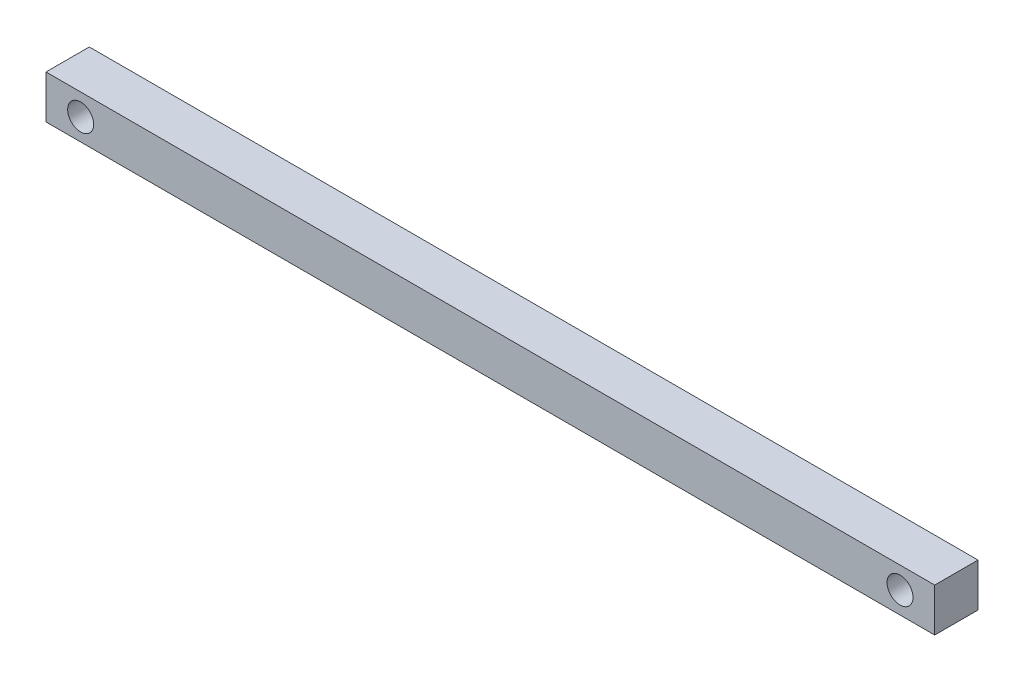
ISO-10303-21;
HEADER;
FILE_DESCRIPTION(('STEP AP214'),'2;1');
FILE_NAME('part.step','',(''),(''),'','','');
FILE_SCHEMA(('AUTOMOTIVE_DESIGN { 1 0 10303 214 1 1 1 1 }'));
ENDSEC;
DATA;
#1=APPLICATION_CONTEXT('core data for automotive mechanical design processes');
#2=APPLICATION_PROTOCOL_DEFINITION('international standard','automotive_design',2000,#1);
#3=PRODUCT_CONTEXT('',#1,'mechanical');
#4=PRODUCT('Part','Part','',(#3));
#5=PRODUCT_RELATED_PRODUCT_CATEGORY('part','',(#4));
#6=PRODUCT_DEFINITION_FORMATION('','',#4);
#7=PRODUCT_DEFINITION_CONTEXT('part definition',#1,'design');
#8=PRODUCT_DEFINITION('design','',#6,#7);
#9=PRODUCT_DEFINITION_SHAPE('','',#8);
#10=(LENGTH_UNIT() NAMED_UNIT(*) SI_UNIT(.MILLI.,.METRE.));
#11=(NAMED_UNIT(*) PLANE_ANGLE_UNIT() SI_UNIT($,.RADIAN.));
#12=(NAMED_UNIT(*) SI_UNIT($,.STERADIAN.) SOLID_ANGLE_UNIT());
#13=UNCERTAINTY_MEASURE_WITH_UNIT(LENGTH_MEASURE(1.E-05),#10,'distance_accuracy_value','');
#14=(GEOMETRIC_REPRESENTATION_CONTEXT(3) GLOBAL_UNCERTAINTY_ASSIGNED_CONTEXT((#13)) GLOBAL_UNIT_ASSIGNED_CONTEXT((#10,
#11,#12)) REPRESENTATION_CONTEXT('',''));
#15=CARTESIAN_POINT('',(0.,0.,0.));
#16=DIRECTION('',(0.,0.,1.));
#17=DIRECTION('',(1.,0.,0.));
#18=AXIS2_PLACEMENT_3D('',#15,#16,#17);
#19=CARTESIAN_POINT('',(0.,0.,25.));
#20=DIRECTION('',(0.,0.,1.));
#21=DIRECTION('',(1.,0.,0.));
#22=AXIS2_PLACEMENT_3D('',#19,#20,#21);
#23=PLANE('',#22);
#24=CARTESIAN_POINT('',(-236.5,0.,25.));
#25=DIRECTION('',(0.,0.,1.));
#26=DIRECTION('',(1.,0.,0.));
#27=AXIS2_PLACEMENT_3D('',#24,#25,#26);
#28=CIRCLE('',#27,7.50000000000001);
#29=CARTESIAN_POINT('',(-229.,0.,25.));
#30=VERTEX_POINT('',#29);
#31=EDGE_CURVE('E112',#30,#30,#28,.T.);
#32=ORIENTED_EDGE('',*,*,#31,.F.);
#33=EDGE_LOOP('',(#32));
#34=FACE_BOUND('',#33,.T.);
#35=DIRECTION('',(0.,1.,0.));
#36=VECTOR('',#35,1.);
#37=CARTESIAN_POINT('',(256.5,12.5,25.));
#38=LINE('',#37,#36);
#39=CARTESIAN_POINT('',(256.5,-12.5,25.));
#40=VERTEX_POINT('',#39);
#41=CARTESIAN_POINT('',(256.5,12.5,25.));
#42=VERTEX_POINT('',#41);
#43=EDGE_CURVE('E92',#40,#42,#38,.T.);
#44=ORIENTED_EDGE('',*,*,#43,.T.);
#45=DIRECTION('',(-1.,0.,0.));
#46=VECTOR('',#45,1.);
#47=CARTESIAN_POINT('',(-256.5,12.5,25.));
#48=LINE('',#47,#46);
#49=CARTESIAN_POINT('',(-256.5,12.5,25.));
#50=VERTEX_POINT('',#49);
#51=EDGE_CURVE('E87',#42,#50,#48,.T.);
#52=ORIENTED_EDGE('',*,*,#51,.T.);
#53=DIRECTION('',(0.,-1.,0.));
#54=VECTOR('',#53,1.);
#55=CARTESIAN_POINT('',(-256.5,12.5,25.));
#56=LINE('',#55,#54);
#57=CARTESIAN_POINT('',(-256.5,-12.5,25.));
#58=VERTEX_POINT('',#57);
#59=EDGE_CURVE('E90',#50,#58,#56,.T.);
#60=ORIENTED_EDGE('',*,*,#59,.T.);
#61=DIRECTION('',(1.,0.,0.));
#62=VECTOR('',#61,1.);
#63=CARTESIAN_POINT('',(-256.5,-12.5,25.));
#64=LINE('',#63,#62);
#65=EDGE_CURVE('E57',#58,#40,#64,.T.);
#66=ORIENTED_EDGE('',*,*,#65,.T.);
#67=EDGE_LOOP('',(#44,#52,#60,#66));
#68=FACE_BOUND('',#67,.T.);
#69=CARTESIAN_POINT('',(236.5,0.,25.));
#70=DIRECTION('',(0.,0.,1.));
#71=DIRECTION('',(1.,0.,0.));
#72=AXIS2_PLACEMENT_3D('',#69,#70,#71);
#73=CIRCLE('',#72,7.50000000000001);
#74=CARTESIAN_POINT('',(244.,0.,25.));
#75=VERTEX_POINT('',#74);
#76=EDGE_CURVE('E134',#75,#75,#73,.T.);
#77=ORIENTED_EDGE('',*,*,#76,.F.);
#78=EDGE_LOOP('',(#77));
#79=FACE_BOUND('',#78,.T.);
#80=ADVANCED_FACE('F39',(#34,#68,#79),#23,.T.);
#81=CARTESIAN_POINT('',(0.,0.,0.));
#82=DIRECTION('',(0.,0.,1.));
#83=DIRECTION('',(1.,0.,0.));
#84=AXIS2_PLACEMENT_3D('',#81,#82,#83);
#85=PLANE('',#84);
#86=DIRECTION('',(0.,1.,0.));
#87=VECTOR('',#86,1.);
#88=CARTESIAN_POINT('',(256.5,12.5,0.));
#89=LINE('',#88,#87);
#90=CARTESIAN_POINT('',(256.5,-12.5,0.));
#91=VERTEX_POINT('',#90);
#92=CARTESIAN_POINT('',(256.5,12.5,0.));
#93=VERTEX_POINT('',#92);
#94=EDGE_CURVE('E108',#91,#93,#89,.T.);
#95=ORIENTED_EDGE('',*,*,#94,.F.);
#96=DIRECTION('',(1.,0.,0.));
#97=VECTOR('',#96,1.);
#98=CARTESIAN_POINT('',(-256.5,-12.5,0.));
#99=LINE('',#98,#97);
#100=CARTESIAN_POINT('',(-256.5,-12.5,0.));
#101=VERTEX_POINT('',#100);
#102=EDGE_CURVE('E80',#101,#91,#99,.T.);
#103=ORIENTED_EDGE('',*,*,#102,.F.);
#104=DIRECTION('',(0.,-1.,0.));
#105=VECTOR('',#104,1.);
#106=CARTESIAN_POINT('',(-256.5,12.5,0.));
#107=LINE('',#106,#105);
#108=CARTESIAN_POINT('',(-256.5,12.5,0.));
#109=VERTEX_POINT('',#108);
#110=EDGE_CURVE('E74',#109,#101,#107,.T.);
#111=ORIENTED_EDGE('',*,*,#110,.F.);
#112=DIRECTION('',(-1.,0.,0.));
#113=VECTOR('',#112,1.);
#114=CARTESIAN_POINT('',(-256.5,12.5,0.));
#115=LINE('',#114,#113);
#116=EDGE_CURVE('E97',#93,#109,#115,.T.);
#117=ORIENTED_EDGE('',*,*,#116,.F.);
#118=EDGE_LOOP('',(#95,#103,#111,#117));
#119=FACE_BOUND('',#118,.T.);
#120=CARTESIAN_POINT('',(-236.5,0.,0.));
#121=DIRECTION('',(0.,0.,1.));
#122=DIRECTION('',(1.,0.,0.));
#123=AXIS2_PLACEMENT_3D('',#120,#121,#122);
#124=CIRCLE('',#123,7.50000000000001);
#125=CARTESIAN_POINT('',(-229.,0.,0.));
#126=VERTEX_POINT('',#125);
#127=EDGE_CURVE('E130',#126,#126,#124,.T.);
#128=ORIENTED_EDGE('',*,*,#127,.T.);
#129=EDGE_LOOP('',(#128));
#130=FACE_BOUND('',#129,.T.);
#131=CARTESIAN_POINT('',(236.5,0.,0.));
#132=DIRECTION('',(0.,0.,1.));
#133=DIRECTION('',(1.,0.,0.));
#134=AXIS2_PLACEMENT_3D('',#131,#132,#133);
#135=CIRCLE('',#134,7.50000000000001);
#136=CARTESIAN_POINT('',(244.,0.,0.));
#137=VERTEX_POINT('',#136);
#138=EDGE_CURVE('E138',#137,#137,#135,.T.);
#139=ORIENTED_EDGE('',*,*,#138,.T.);
#140=EDGE_LOOP('',(#139));
#141=FACE_BOUND('',#140,.T.);
#142=ADVANCED_FACE('F125',(#119,#130,#141),#85,.F.);
#143=CARTESIAN_POINT('',(256.5,12.5,25.));
#144=DIRECTION('',(-1.,0.,0.));
#145=DIRECTION('',(0.,0.,1.));
#146=AXIS2_PLACEMENT_3D('',#143,#144,#145);
#147=PLANE('',#146);
#148=ORIENTED_EDGE('',*,*,#94,.T.);
#149=DIRECTION('',(0.,0.,-1.));
#150=VECTOR('',#149,1.);
#151=CARTESIAN_POINT('',(256.5,12.5,25.));
#152=LINE('',#151,#150);
#153=EDGE_CURVE('E11',#42,#93,#152,.T.);
#154=ORIENTED_EDGE('',*,*,#153,.F.);
#155=ORIENTED_EDGE('',*,*,#43,.F.);
#156=DIRECTION('',(0.,0.,-1.));
#157=VECTOR('',#156,1.);
#158=CARTESIAN_POINT('',(256.5,-12.5,25.));
#159=LINE('',#158,#157);
#160=EDGE_CURVE('E104',#40,#91,#159,.T.);
#161=ORIENTED_EDGE('',*,*,#160,.T.);
#162=EDGE_LOOP('',(#148,#154,#155,#161));
#163=FACE_BOUND('',#162,.T.);
#164=ADVANCED_FACE('F41',(#163),#147,.F.);
#165=CARTESIAN_POINT('',(-256.5,12.5,25.));
#166=DIRECTION('',(0.,-1.,0.));
#167=DIRECTION('',(0.,0.,-1.));
#168=AXIS2_PLACEMENT_3D('',#165,#166,#167);
#169=PLANE('',#168);
#170=ORIENTED_EDGE('',*,*,#116,.T.);
#171=DIRECTION('',(0.,0.,-1.));
#172=VECTOR('',#171,1.);
#173=CARTESIAN_POINT('',(-256.5,12.5,25.));
#174=LINE('',#173,#172);
#175=EDGE_CURVE('E49',#50,#109,#174,.T.);
#176=ORIENTED_EDGE('',*,*,#175,.F.);
#177=ORIENTED_EDGE('',*,*,#51,.F.);
#178=ORIENTED_EDGE('',*,*,#153,.T.);
#179=EDGE_LOOP('',(#170,#176,#177,#178));
#180=FACE_BOUND('',#179,.T.);
#181=ADVANCED_FACE('F96',(#180),#169,.F.);
#182=CARTESIAN_POINT('',(-256.5,12.5,25.));
#183=DIRECTION('',(1.,0.,0.));
#184=DIRECTION('',(0.,0.,-1.));
#185=AXIS2_PLACEMENT_3D('',#182,#183,#184);
#186=PLANE('',#185);
#187=ORIENTED_EDGE('',*,*,#110,.T.);
#188=DIRECTION('',(0.,0.,-1.));
#189=VECTOR('',#188,1.);
#190=CARTESIAN_POINT('',(-256.5,-12.5,25.));
#191=LINE('',#190,#189);
#192=EDGE_CURVE('E99',#58,#101,#191,.T.);
#193=ORIENTED_EDGE('',*,*,#192,.F.);
#194=ORIENTED_EDGE('',*,*,#59,.F.);
#195=ORIENTED_EDGE('',*,*,#175,.T.);
#196=EDGE_LOOP('',(#187,#193,#194,#195));
#197=FACE_BOUND('',#196,.T.);
#198=ADVANCED_FACE('F100',(#197),#186,.F.);
#199=CARTESIAN_POINT('',(-256.5,-12.5,25.));
#200=DIRECTION('',(0.,1.,0.));
#201=DIRECTION('',(0.,0.,1.));
#202=AXIS2_PLACEMENT_3D('',#199,#200,#201);
#203=PLANE('',#202);
#204=ORIENTED_EDGE('',*,*,#102,.T.);
#205=ORIENTED_EDGE('',*,*,#160,.F.);
#206=ORIENTED_EDGE('',*,*,#65,.F.);
#207=ORIENTED_EDGE('',*,*,#192,.T.);
#208=EDGE_LOOP('',(#204,#205,#206,#207));
#209=FACE_BOUND('',#208,.T.);
#210=ADVANCED_FACE('F122',(#209),#203,.F.);
#211=CARTESIAN_POINT('',(-236.5,0.,25.));
#212=DIRECTION('',(0.,0.,-1.));
#213=DIRECTION('',(-1.,0.,0.));
#214=AXIS2_PLACEMENT_3D('',#211,#212,#213);
#215=CYLINDRICAL_SURFACE('',#214,7.50000000000001);
#216=ORIENTED_EDGE('',*,*,#31,.T.);
#217=EDGE_LOOP('',(#216));
#218=FACE_BOUND('',#217,.T.);
#219=ORIENTED_EDGE('',*,*,#127,.F.);
#220=EDGE_LOOP('',(#219));
#221=FACE_BOUND('',#220,.T.);
#222=ADVANCED_FACE('F157',(#218,#221),#215,.F.);
#223=CARTESIAN_POINT('',(236.5,0.,25.));
#224=DIRECTION('',(0.,0.,-1.));
#225=DIRECTION('',(-1.,0.,0.));
#226=AXIS2_PLACEMENT_3D('',#223,#224,#225);
#227=CYLINDRICAL_SURFACE('',#226,7.50000000000001);
#228=ORIENTED_EDGE('',*,*,#76,.T.);
#229=EDGE_LOOP('',(#228));
#230=FACE_BOUND('',#229,.T.);
#231=ORIENTED_EDGE('',*,*,#138,.F.);
#232=EDGE_LOOP('',(#231));
#233=FACE_BOUND('',#232,.T.);
#234=ADVANCED_FACE('F146',(#230,#233),#227,.F.);
#235=CLOSED_SHELL('',(#80,#142,#164,#181,#198,#210,#222,#234));
#236=MANIFOLD_SOLID_BREP('B2',#235);
#237=ADVANCED_BREP_SHAPE_REPRESENTATION('',(#18,#236),#14);
#238=SHAPE_DEFINITION_REPRESENTATION(#9,#237);
ENDSEC;
END-ISO-10303-21;
